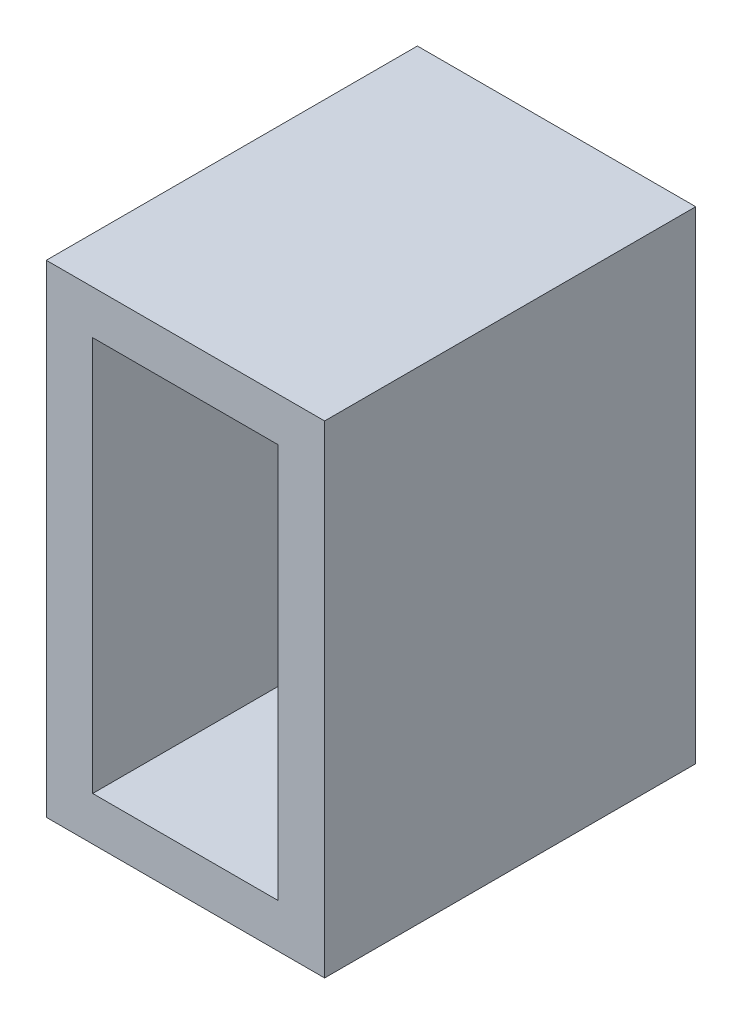
ISO-10303-21;
HEADER;
FILE_DESCRIPTION(('STEP AP214'),'2;1');
FILE_NAME('part.step','',(''),(''),'','','');
FILE_SCHEMA(('AUTOMOTIVE_DESIGN { 1 0 10303 214 1 1 1 1 }'));
ENDSEC;
DATA;
#1=APPLICATION_CONTEXT('core data for automotive mechanical design processes');
#2=APPLICATION_PROTOCOL_DEFINITION('international standard','automotive_design',2000,#1);
#3=PRODUCT_CONTEXT('',#1,'mechanical');
#4=PRODUCT('Part','Part','',(#3));
#5=PRODUCT_RELATED_PRODUCT_CATEGORY('part','',(#4));
#6=PRODUCT_DEFINITION_FORMATION('','',#4);
#7=PRODUCT_DEFINITION_CONTEXT('part definition',#1,'design');
#8=PRODUCT_DEFINITION('design','',#6,#7);
#9=PRODUCT_DEFINITION_SHAPE('','',#8);
#10=(LENGTH_UNIT() NAMED_UNIT(*) SI_UNIT(.MILLI.,.METRE.));
#11=(NAMED_UNIT(*) PLANE_ANGLE_UNIT() SI_UNIT($,.RADIAN.));
#12=(NAMED_UNIT(*) SI_UNIT($,.STERADIAN.) SOLID_ANGLE_UNIT());
#13=UNCERTAINTY_MEASURE_WITH_UNIT(LENGTH_MEASURE(1.E-05),#10,'distance_accuracy_value','');
#14=(GEOMETRIC_REPRESENTATION_CONTEXT(3) GLOBAL_UNCERTAINTY_ASSIGNED_CONTEXT((#13)) GLOBAL_UNIT_ASSIGNED_CONTEXT((#10,
#11,#12)) REPRESENTATION_CONTEXT('',''));
#15=CARTESIAN_POINT('',(0.,0.,0.));
#16=DIRECTION('',(0.,0.,1.));
#17=DIRECTION('',(1.,0.,0.));
#18=AXIS2_PLACEMENT_3D('',#15,#16,#17);
#19=CARTESIAN_POINT('',(0.,0.,5.588));
#20=DIRECTION('',(0.,0.,-1.));
#21=DIRECTION('',(-1.,0.,0.));
#22=AXIS2_PLACEMENT_3D('',#19,#20,#21);
#23=PLANE('',#22);
#24=DIRECTION('',(0.,1.,0.));
#25=VECTOR('',#24,1.);
#26=CARTESIAN_POINT('',(2.83827178729691,-26.357658788774,5.588));
#27=LINE('',#26,#25);
#28=CARTESIAN_POINT('',(2.83827178729691,-26.357658788774,5.588));
#29=VERTEX_POINT('',#28);
#30=CARTESIAN_POINT('',(2.83827178729691,-19.277408788774,5.588));
#31=VERTEX_POINT('',#30);
#32=EDGE_CURVE('E428',#29,#31,#27,.T.);
#33=ORIENTED_EDGE('',*,*,#32,.F.);
#34=DIRECTION('',(-1.,0.,0.));
#35=VECTOR('',#34,1.);
#36=CARTESIAN_POINT('',(0.,-26.357658788774,5.588));
#37=LINE('',#36,#35);
#38=CARTESIAN_POINT('',(-5.67072821270309,-26.357658788774,5.588));
#39=VERTEX_POINT('',#38);
#40=EDGE_CURVE('E265',#29,#39,#37,.T.);
#41=ORIENTED_EDGE('',*,*,#40,.T.);
#42=DIRECTION('',(0.,-1.,0.));
#43=VECTOR('',#42,1.);
#44=CARTESIAN_POINT('',(-5.67072821270309,-26.357658788774,5.588));
#45=LINE('',#44,#43);
#46=CARTESIAN_POINT('',(-5.67072821270309,-19.277408788774,5.588));
#47=VERTEX_POINT('',#46);
#48=EDGE_CURVE('E454',#47,#39,#45,.T.);
#49=ORIENTED_EDGE('',*,*,#48,.F.);
#50=DIRECTION('',(-1.,0.,0.));
#51=VECTOR('',#50,1.);
#52=CARTESIAN_POINT('',(0.,-19.277408788774,5.588));
#53=LINE('',#52,#51);
#54=EDGE_CURVE('E270',#31,#47,#53,.T.);
#55=ORIENTED_EDGE('',*,*,#54,.F.);
#56=EDGE_LOOP('',(#33,#41,#49,#55));
#57=FACE_BOUND('',#56,.T.);
#58=ADVANCED_FACE('F41',(#57),#23,.T.);
#59=DIRECTION('',(0.,1.,0.));
#60=VECTOR('',#59,1.);
#61=CARTESIAN_POINT('',(2.83827178729691,20.600591211226,5.588));
#62=LINE('',#61,#60);
#63=CARTESIAN_POINT('',(2.83827178729691,20.600591211226,5.588));
#64=VERTEX_POINT('',#63);
#65=CARTESIAN_POINT('',(2.83827178729691,27.680841211226,5.588));
#66=VERTEX_POINT('',#65);
#67=EDGE_CURVE('E207',#64,#66,#62,.T.);
#68=ORIENTED_EDGE('',*,*,#67,.F.);
#69=DIRECTION('',(-1.,0.,0.));
#70=VECTOR('',#69,1.);
#71=CARTESIAN_POINT('',(0.,20.600591211226,5.588));
#72=LINE('',#71,#70);
#73=CARTESIAN_POINT('',(-5.67072821270309,20.600591211226,5.588));
#74=VERTEX_POINT('',#73);
#75=EDGE_CURVE('E275',#64,#74,#72,.T.);
#76=ORIENTED_EDGE('',*,*,#75,.T.);
#77=CARTESIAN_POINT('',(-5.67072821270309,27.680841211226,5.588));
#78=VERTEX_POINT('',#77);
#79=EDGE_CURVE('E449',#78,#74,#45,.T.);
#80=ORIENTED_EDGE('',*,*,#79,.F.);
#81=DIRECTION('',(-1.,0.,0.));
#82=VECTOR('',#81,1.);
#83=CARTESIAN_POINT('',(0.,27.680841211226,5.588));
#84=LINE('',#83,#82);
#85=EDGE_CURVE('E264',#66,#78,#84,.T.);
#86=ORIENTED_EDGE('',*,*,#85,.F.);
#87=EDGE_LOOP('',(#68,#76,#80,#86));
#88=FACE_BOUND('',#87,.T.);
#89=ADVANCED_FACE('F490',(#88),#23,.T.);
#90=CARTESIAN_POINT('',(0.,20.600591211226,8.128));
#91=DIRECTION('',(0.,-1.,0.));
#92=DIRECTION('',(0.,0.,-1.));
#93=AXIS2_PLACEMENT_3D('',#90,#91,#92);
#94=PLANE('',#93);
#95=DIRECTION('',(0.,0.,-1.));
#96=VECTOR('',#95,1.);
#97=CARTESIAN_POINT('',(2.83827178729691,20.600591211226,8.128));
#98=LINE('',#97,#96);
#99=CARTESIAN_POINT('',(2.83827178729691,20.600591211226,8.128));
#100=VERTEX_POINT('',#99);
#101=EDGE_CURVE('E415',#100,#64,#98,.T.);
#102=ORIENTED_EDGE('',*,*,#101,.F.);
#103=DIRECTION('',(-1.,0.,0.));
#104=VECTOR('',#103,1.);
#105=CARTESIAN_POINT('',(0.,20.600591211226,8.128));
#106=LINE('',#105,#104);
#107=CARTESIAN_POINT('',(-5.67072821270309,20.600591211226,8.128));
#108=VERTEX_POINT('',#107);
#109=EDGE_CURVE('E221',#100,#108,#106,.T.);
#110=ORIENTED_EDGE('',*,*,#109,.T.);
#111=DIRECTION('',(0.,0.,-1.));
#112=VECTOR('',#111,1.);
#113=CARTESIAN_POINT('',(-5.67072821270309,20.600591211226,8.128));
#114=LINE('',#113,#112);
#115=EDGE_CURVE('E281',#108,#74,#114,.T.);
#116=ORIENTED_EDGE('',*,*,#115,.T.);
#117=ORIENTED_EDGE('',*,*,#75,.F.);
#118=EDGE_LOOP('',(#102,#110,#116,#117));
#119=FACE_BOUND('',#118,.T.);
#120=ADVANCED_FACE('F496',(#119),#94,.T.);
#121=CARTESIAN_POINT('',(0.,-19.277408788774,8.128));
#122=DIRECTION('',(0.,-1.,0.));
#123=DIRECTION('',(0.,0.,-1.));
#124=AXIS2_PLACEMENT_3D('',#121,#122,#123);
#125=PLANE('',#124);
#126=DIRECTION('',(-1.,0.,0.));
#127=VECTOR('',#126,1.);
#128=CARTESIAN_POINT('',(0.,-19.277408788774,8.128));
#129=LINE('',#128,#127);
#130=CARTESIAN_POINT('',(2.83827178729691,-19.277408788774,8.128));
#131=VERTEX_POINT('',#130);
#132=CARTESIAN_POINT('',(-5.67072821270309,-19.277408788774,8.128));
#133=VERTEX_POINT('',#132);
#134=EDGE_CURVE('E247',#131,#133,#129,.T.);
#135=ORIENTED_EDGE('',*,*,#134,.F.);
#136=DIRECTION('',(0.,0.,-1.));
#137=VECTOR('',#136,1.);
#138=CARTESIAN_POINT('',(2.83827178729691,-19.277408788774,8.128));
#139=LINE('',#138,#137);
#140=EDGE_CURVE('E427',#131,#31,#139,.T.);
#141=ORIENTED_EDGE('',*,*,#140,.T.);
#142=ORIENTED_EDGE('',*,*,#54,.T.);
#143=DIRECTION('',(0.,0.,-1.));
#144=VECTOR('',#143,1.);
#145=CARTESIAN_POINT('',(-5.67072821270309,-19.277408788774,8.128));
#146=LINE('',#145,#144);
#147=EDGE_CURVE('E259',#133,#47,#146,.T.);
#148=ORIENTED_EDGE('',*,*,#147,.F.);
#149=EDGE_LOOP('',(#135,#141,#142,#148));
#150=FACE_BOUND('',#149,.T.);
#151=ADVANCED_FACE('F506',(#150),#125,.F.);
#152=CARTESIAN_POINT('',(0.,0.,8.128));
#153=DIRECTION('',(0.,0.,-1.));
#154=DIRECTION('',(-1.,0.,0.));
#155=AXIS2_PLACEMENT_3D('',#152,#153,#154);
#156=PLANE('',#155);
#157=ORIENTED_EDGE('',*,*,#109,.F.);
#158=DIRECTION('',(0.,1.,0.));
#159=VECTOR('',#158,1.);
#160=CARTESIAN_POINT('',(2.83827178729691,20.600591211226,8.128));
#161=LINE('',#160,#159);
#162=CARTESIAN_POINT('',(2.83827178729691,27.680841211226,8.128));
#163=VERTEX_POINT('',#162);
#164=EDGE_CURVE('E204',#100,#163,#161,.T.);
#165=ORIENTED_EDGE('',*,*,#164,.T.);
#166=DIRECTION('',(-1.,0.,0.));
#167=VECTOR('',#166,1.);
#168=CARTESIAN_POINT('',(0.,27.680841211226,8.128));
#169=LINE('',#168,#167);
#170=CARTESIAN_POINT('',(-8.59172821270309,27.680841211226,8.128));
#171=VERTEX_POINT('',#170);
#172=EDGE_CURVE('E218',#163,#171,#169,.T.);
#173=ORIENTED_EDGE('',*,*,#172,.T.);
#174=DIRECTION('',(0.,-1.,0.));
#175=VECTOR('',#174,1.);
#176=CARTESIAN_POINT('',(-8.59172821270309,0.,8.128));
#177=LINE('',#176,#175);
#178=CARTESIAN_POINT('',(-8.59172821270309,-26.357658788774,8.128));
#179=VERTEX_POINT('',#178);
#180=EDGE_CURVE('E231',#171,#179,#177,.T.);
#181=ORIENTED_EDGE('',*,*,#180,.T.);
#182=DIRECTION('',(-1.,0.,0.));
#183=VECTOR('',#182,1.);
#184=CARTESIAN_POINT('',(0.,-26.357658788774,8.128));
#185=LINE('',#184,#183);
#186=CARTESIAN_POINT('',(2.83827178729691,-26.357658788774,8.128));
#187=VERTEX_POINT('',#186);
#188=EDGE_CURVE('E280',#187,#179,#185,.T.);
#189=ORIENTED_EDGE('',*,*,#188,.F.);
#190=DIRECTION('',(0.,1.,0.));
#191=VECTOR('',#190,1.);
#192=CARTESIAN_POINT('',(2.83827178729691,-26.357658788774,8.128));
#193=LINE('',#192,#191);
#194=EDGE_CURVE('E419',#187,#131,#193,.T.);
#195=ORIENTED_EDGE('',*,*,#194,.T.);
#196=ORIENTED_EDGE('',*,*,#134,.T.);
#197=DIRECTION('',(0.,1.,0.));
#198=VECTOR('',#197,1.);
#199=CARTESIAN_POINT('',(-5.67072821270309,0.,8.128));
#200=LINE('',#199,#198);
#201=EDGE_CURVE('E244',#133,#108,#200,.T.);
#202=ORIENTED_EDGE('',*,*,#201,.T.);
#203=EDGE_LOOP('',(#157,#165,#173,#181,#189,#195,#196,#202));
#204=FACE_BOUND('',#203,.T.);
#205=ADVANCED_FACE('F216',(#204),#156,.F.);
#206=DIRECTION('',(0.,-1.,0.));
#207=VECTOR('',#206,1.);
#208=CARTESIAN_POINT('',(5.37827178729691,-26.357658788774,5.588));
#209=LINE('',#208,#207);
#210=CARTESIAN_POINT('',(5.37827178729691,-19.277408788774,5.588));
#211=VERTEX_POINT('',#210);
#212=CARTESIAN_POINT('',(5.37827178729691,-26.357658788774,5.588));
#213=VERTEX_POINT('',#212);
#214=EDGE_CURVE('E424',#211,#213,#209,.T.);
#215=ORIENTED_EDGE('',*,*,#214,.F.);
#216=CARTESIAN_POINT('',(13.8872717872969,-19.277408788774,5.588));
#217=VERTEX_POINT('',#216);
#218=EDGE_CURVE('E271',#217,#211,#53,.T.);
#219=ORIENTED_EDGE('',*,*,#218,.F.);
#220=DIRECTION('',(0.,1.,0.));
#221=VECTOR('',#220,1.);
#222=CARTESIAN_POINT('',(13.8872717872969,-26.357658788774,5.588));
#223=LINE('',#222,#221);
#224=CARTESIAN_POINT('',(13.8872717872969,-26.357658788774,5.588));
#225=VERTEX_POINT('',#224);
#226=EDGE_CURVE('E447',#225,#217,#223,.T.);
#227=ORIENTED_EDGE('',*,*,#226,.F.);
#228=EDGE_CURVE('E260',#225,#213,#37,.T.);
#229=ORIENTED_EDGE('',*,*,#228,.T.);
#230=EDGE_LOOP('',(#215,#219,#227,#229));
#231=FACE_BOUND('',#230,.T.);
#232=ADVANCED_FACE('F487',(#231),#23,.T.);
#233=DIRECTION('',(0.,-1.,0.));
#234=VECTOR('',#233,1.);
#235=CARTESIAN_POINT('',(5.37827178729691,20.600591211226,5.588));
#236=LINE('',#235,#234);
#237=CARTESIAN_POINT('',(5.37827178729691,27.680841211226,5.588));
#238=VERTEX_POINT('',#237);
#239=CARTESIAN_POINT('',(5.37827178729691,20.600591211226,5.588));
#240=VERTEX_POINT('',#239);
#241=EDGE_CURVE('E223',#238,#240,#236,.T.);
#242=ORIENTED_EDGE('',*,*,#241,.F.);
#243=CARTESIAN_POINT('',(13.8872717872969,27.680841211226,5.588));
#244=VERTEX_POINT('',#243);
#245=EDGE_CURVE('E266',#244,#238,#84,.T.);
#246=ORIENTED_EDGE('',*,*,#245,.F.);
#247=DIRECTION('',(0.,-1.,0.));
#248=VECTOR('',#247,1.);
#249=CARTESIAN_POINT('',(13.8872717872969,0.,5.588));
#250=LINE('',#249,#248);
#251=CARTESIAN_POINT('',(13.8872717872969,20.600591211226,5.588));
#252=VERTEX_POINT('',#251);
#253=EDGE_CURVE('E11',#244,#252,#250,.T.);
#254=ORIENTED_EDGE('',*,*,#253,.T.);
#255=EDGE_CURVE('E276',#252,#240,#72,.T.);
#256=ORIENTED_EDGE('',*,*,#255,.T.);
#257=EDGE_LOOP('',(#242,#246,#254,#256));
#258=FACE_BOUND('',#257,.T.);
#259=ADVANCED_FACE('F480',(#258),#23,.T.);
#260=CARTESIAN_POINT('',(-8.59172821270309,27.680841211226,50.8));
#261=DIRECTION('',(1.,0.,0.));
#262=DIRECTION('',(0.,1.,0.));
#263=AXIS2_PLACEMENT_3D('',#260,#261,#262);
#264=PLANE('',#263);
#265=DIRECTION('',(0.,0.,-1.));
#266=VECTOR('',#265,1.);
#267=CARTESIAN_POINT('',(-8.59172821270309,-26.357658788774,50.8));
#268=LINE('',#267,#266);
#269=CARTESIAN_POINT('',(-8.59172821270309,-26.357658788774,50.8));
#270=VERTEX_POINT('',#269);
#271=EDGE_CURVE('E326',#270,#179,#268,.T.);
#272=ORIENTED_EDGE('',*,*,#271,.T.);
#273=ORIENTED_EDGE('',*,*,#180,.F.);
#274=DIRECTION('',(0.,0.,-1.));
#275=VECTOR('',#274,1.);
#276=CARTESIAN_POINT('',(-8.59172821270309,27.680841211226,50.8));
#277=LINE('',#276,#275);
#278=CARTESIAN_POINT('',(-8.59172821270309,27.680841211226,50.8));
#279=VERTEX_POINT('',#278);
#280=EDGE_CURVE('E228',#279,#171,#277,.T.);
#281=ORIENTED_EDGE('',*,*,#280,.F.);
#282=DIRECTION('',(0.,-1.,0.));
#283=VECTOR('',#282,1.);
#284=CARTESIAN_POINT('',(-8.59172821270309,27.680841211226,50.8));
#285=LINE('',#284,#283);
#286=EDGE_CURVE('E297',#279,#270,#285,.T.);
#287=ORIENTED_EDGE('',*,*,#286,.T.);
#288=EDGE_LOOP('',(#272,#273,#281,#287));
#289=FACE_BOUND('',#288,.T.);
#290=ADVANCED_FACE('F478',(#289),#264,.T.);
#291=CARTESIAN_POINT('',(-8.59172821270309,-26.357658788774,50.8));
#292=DIRECTION('',(0.,1.,0.));
#293=DIRECTION('',(0.,0.,1.));
#294=AXIS2_PLACEMENT_3D('',#291,#292,#293);
#295=PLANE('',#294);
#296=DIRECTION('',(0.,0.,-1.));
#297=VECTOR('',#296,1.);
#298=CARTESIAN_POINT('',(16.8082717872969,-26.357658788774,50.8));
#299=LINE('',#298,#297);
#300=CARTESIAN_POINT('',(16.8082717872969,-26.357658788774,50.8));
#301=VERTEX_POINT('',#300);
#302=CARTESIAN_POINT('',(16.8082717872969,-26.357658788774,8.128));
#303=VERTEX_POINT('',#302);
#304=EDGE_CURVE('E322',#301,#303,#299,.T.);
#305=ORIENTED_EDGE('',*,*,#304,.T.);
#306=CARTESIAN_POINT('',(5.37827178729691,-26.357658788774,8.128));
#307=VERTEX_POINT('',#306);
#308=EDGE_CURVE('E237',#303,#307,#185,.T.);
#309=ORIENTED_EDGE('',*,*,#308,.T.);
#310=DIRECTION('',(0.,0.,-1.));
#311=VECTOR('',#310,1.);
#312=CARTESIAN_POINT('',(5.37827178729691,-26.357658788774,8.128));
#313=LINE('',#312,#311);
#314=EDGE_CURVE('E65',#307,#213,#313,.T.);
#315=ORIENTED_EDGE('',*,*,#314,.T.);
#316=ORIENTED_EDGE('',*,*,#228,.F.);
#317=DIRECTION('',(0.,0.,1.));
#318=VECTOR('',#317,1.);
#319=CARTESIAN_POINT('',(13.8872717872969,-26.357658788774,-54.1173883631684));
#320=LINE('',#319,#318);
#321=CARTESIAN_POINT('',(13.8872717872969,-26.357658788774,0.));
#322=VERTEX_POINT('',#321);
#323=EDGE_CURVE('E465',#322,#225,#320,.T.);
#324=ORIENTED_EDGE('',*,*,#323,.F.);
#325=DIRECTION('',(1.,0.,0.));
#326=VECTOR('',#325,1.);
#327=CARTESIAN_POINT('',(-8.59172821270309,-26.357658788774,0.));
#328=LINE('',#327,#326);
#329=CARTESIAN_POINT('',(-5.67072821270309,-26.357658788774,0.));
#330=VERTEX_POINT('',#329);
#331=EDGE_CURVE('E285',#330,#322,#328,.T.);
#332=ORIENTED_EDGE('',*,*,#331,.F.);
#333=DIRECTION('',(0.,0.,1.));
#334=VECTOR('',#333,1.);
#335=CARTESIAN_POINT('',(-5.67072821270309,-26.357658788774,-54.1173883631684));
#336=LINE('',#335,#334);
#337=EDGE_CURVE('E453',#330,#39,#336,.T.);
#338=ORIENTED_EDGE('',*,*,#337,.T.);
#339=ORIENTED_EDGE('',*,*,#40,.F.);
#340=DIRECTION('',(0.,0.,-1.));
#341=VECTOR('',#340,1.);
#342=CARTESIAN_POINT('',(2.83827178729691,-26.357658788774,8.128));
#343=LINE('',#342,#341);
#344=EDGE_CURVE('E433',#187,#29,#343,.T.);
#345=ORIENTED_EDGE('',*,*,#344,.F.);
#346=ORIENTED_EDGE('',*,*,#188,.T.);
#347=ORIENTED_EDGE('',*,*,#271,.F.);
#348=DIRECTION('',(1.,0.,0.));
#349=VECTOR('',#348,1.);
#350=CARTESIAN_POINT('',(-8.59172821270309,-26.357658788774,50.8));
#351=LINE('',#350,#349);
#352=EDGE_CURVE('E300',#270,#301,#351,.T.);
#353=ORIENTED_EDGE('',*,*,#352,.T.);
#354=EDGE_LOOP('',(#305,#309,#315,#316,#324,#332,#338,#339,#345,#346,#347,#353));
#355=FACE_BOUND('',#354,.T.);
#356=ADVANCED_FACE('F400',(#355),#295,.T.);
#357=CARTESIAN_POINT('',(16.8082717872969,27.680841211226,50.8));
#358=DIRECTION('',(-1.,0.,0.));
#359=DIRECTION('',(0.,0.,1.));
#360=AXIS2_PLACEMENT_3D('',#357,#358,#359);
#361=PLANE('',#360);
#362=DIRECTION('',(0.,0.,-1.));
#363=VECTOR('',#362,1.);
#364=CARTESIAN_POINT('',(16.8082717872969,27.680841211226,50.8));
#365=LINE('',#364,#363);
#366=CARTESIAN_POINT('',(16.8082717872969,27.680841211226,50.8));
#367=VERTEX_POINT('',#366);
#368=CARTESIAN_POINT('',(16.8082717872969,27.680841211226,8.128));
#369=VERTEX_POINT('',#368);
#370=EDGE_CURVE('E318',#367,#369,#365,.T.);
#371=ORIENTED_EDGE('',*,*,#370,.T.);
#372=DIRECTION('',(0.,-1.,0.));
#373=VECTOR('',#372,1.);
#374=CARTESIAN_POINT('',(16.8082717872969,0.,8.128));
#375=LINE('',#374,#373);
#376=EDGE_CURVE('E236',#369,#303,#375,.T.);
#377=ORIENTED_EDGE('',*,*,#376,.T.);
#378=ORIENTED_EDGE('',*,*,#304,.F.);
#379=DIRECTION('',(0.,1.,0.));
#380=VECTOR('',#379,1.);
#381=CARTESIAN_POINT('',(16.8082717872969,27.680841211226,50.8));
#382=LINE('',#381,#380);
#383=EDGE_CURVE('E304',#301,#367,#382,.T.);
#384=ORIENTED_EDGE('',*,*,#383,.T.);
#385=EDGE_LOOP('',(#371,#377,#378,#384));
#386=FACE_BOUND('',#385,.T.);
#387=ADVANCED_FACE('F403',(#386),#361,.T.);
#388=CARTESIAN_POINT('',(-8.59172821270309,27.680841211226,50.8));
#389=DIRECTION('',(0.,-1.,0.));
#390=DIRECTION('',(1.,0.,0.));
#391=AXIS2_PLACEMENT_3D('',#388,#389,#390);
#392=PLANE('',#391);
#393=ORIENTED_EDGE('',*,*,#280,.T.);
#394=ORIENTED_EDGE('',*,*,#172,.F.);
#395=DIRECTION('',(0.,0.,-1.));
#396=VECTOR('',#395,1.);
#397=CARTESIAN_POINT('',(2.83827178729691,27.680841211226,8.128));
#398=LINE('',#397,#396);
#399=EDGE_CURVE('E201',#163,#66,#398,.T.);
#400=ORIENTED_EDGE('',*,*,#399,.T.);
#401=ORIENTED_EDGE('',*,*,#85,.T.);
#402=DIRECTION('',(0.,0.,1.));
#403=VECTOR('',#402,1.);
#404=CARTESIAN_POINT('',(-5.67072821270309,27.680841211226,-54.1173883631684));
#405=LINE('',#404,#403);
#406=CARTESIAN_POINT('',(-5.67072821270309,27.680841211226,0.));
#407=VERTEX_POINT('',#406);
#408=EDGE_CURVE('E448',#407,#78,#405,.T.);
#409=ORIENTED_EDGE('',*,*,#408,.F.);
#410=DIRECTION('',(-1.,0.,0.));
#411=VECTOR('',#410,1.);
#412=CARTESIAN_POINT('',(-8.59172821270309,27.680841211226,0.));
#413=LINE('',#412,#411);
#414=CARTESIAN_POINT('',(13.8872717872969,27.680841211226,0.));
#415=VERTEX_POINT('',#414);
#416=EDGE_CURVE('E301',#415,#407,#413,.T.);
#417=ORIENTED_EDGE('',*,*,#416,.F.);
#418=DIRECTION('',(0.,0.,1.));
#419=VECTOR('',#418,1.);
#420=CARTESIAN_POINT('',(13.8872717872969,27.680841211226,-54.1173883631684));
#421=LINE('',#420,#419);
#422=EDGE_CURVE('E468',#415,#244,#421,.T.);
#423=ORIENTED_EDGE('',*,*,#422,.T.);
#424=ORIENTED_EDGE('',*,*,#245,.T.);
#425=DIRECTION('',(0.,0.,-1.));
#426=VECTOR('',#425,1.);
#427=CARTESIAN_POINT('',(5.37827178729691,27.680841211226,8.128));
#428=LINE('',#427,#426);
#429=CARTESIAN_POINT('',(5.37827178729691,27.680841211226,8.128));
#430=VERTEX_POINT('',#429);
#431=EDGE_CURVE('E212',#430,#238,#428,.T.);
#432=ORIENTED_EDGE('',*,*,#431,.F.);
#433=EDGE_CURVE('E230',#369,#430,#169,.T.);
#434=ORIENTED_EDGE('',*,*,#433,.F.);
#435=ORIENTED_EDGE('',*,*,#370,.F.);
#436=DIRECTION('',(-1.,0.,0.));
#437=VECTOR('',#436,1.);
#438=CARTESIAN_POINT('',(-8.59172821270309,27.680841211226,50.8));
#439=LINE('',#438,#437);
#440=EDGE_CURVE('E308',#367,#279,#439,.T.);
#441=ORIENTED_EDGE('',*,*,#440,.T.);
#442=EDGE_LOOP('',(#393,#394,#400,#401,#409,#417,#423,#424,#432,#434,#435,#441));
#443=FACE_BOUND('',#442,.T.);
#444=ADVANCED_FACE('F226',(#443),#392,.T.);
#445=CARTESIAN_POINT('',(0.,0.,50.8));
#446=DIRECTION('',(0.,0.,1.));
#447=DIRECTION('',(1.,0.,0.));
#448=AXIS2_PLACEMENT_3D('',#445,#446,#447);
#449=PLANE('',#448);
#450=DIRECTION('',(0.,-1.,0.));
#451=VECTOR('',#450,1.);
#452=CARTESIAN_POINT('',(-14.9417282127031,33.681591211226,50.8));
#453=LINE('',#452,#451);
#454=CARTESIAN_POINT('',(-14.9417282127031,33.681591211226,50.8));
#455=VERTEX_POINT('',#454);
#456=CARTESIAN_POINT('',(-14.9417282127031,-32.358408788774,50.8));
#457=VERTEX_POINT('',#456);
#458=EDGE_CURVE('E331',#455,#457,#453,.T.);
#459=ORIENTED_EDGE('',*,*,#458,.T.);
#460=DIRECTION('',(1.,0.,0.));
#461=VECTOR('',#460,1.);
#462=CARTESIAN_POINT('',(-14.9417282127031,-32.358408788774,50.8));
#463=LINE('',#462,#461);
#464=CARTESIAN_POINT('',(23.1582717872969,-32.358408788774,50.8));
#465=VERTEX_POINT('',#464);
#466=EDGE_CURVE('E335',#457,#465,#463,.T.);
#467=ORIENTED_EDGE('',*,*,#466,.T.);
#468=DIRECTION('',(0.,1.,0.));
#469=VECTOR('',#468,1.);
#470=CARTESIAN_POINT('',(23.1582717872969,33.681591211226,50.8));
#471=LINE('',#470,#469);
#472=CARTESIAN_POINT('',(23.1582717872969,33.681591211226,50.8));
#473=VERTEX_POINT('',#472);
#474=EDGE_CURVE('E339',#465,#473,#471,.T.);
#475=ORIENTED_EDGE('',*,*,#474,.T.);
#476=DIRECTION('',(-1.,0.,0.));
#477=VECTOR('',#476,1.);
#478=CARTESIAN_POINT('',(-14.9417282127031,33.681591211226,50.8));
#479=LINE('',#478,#477);
#480=EDGE_CURVE('E342',#473,#455,#479,.T.);
#481=ORIENTED_EDGE('',*,*,#480,.T.);
#482=EDGE_LOOP('',(#459,#467,#475,#481));
#483=FACE_BOUND('',#482,.T.);
#484=ORIENTED_EDGE('',*,*,#352,.F.);
#485=ORIENTED_EDGE('',*,*,#286,.F.);
#486=ORIENTED_EDGE('',*,*,#440,.F.);
#487=ORIENTED_EDGE('',*,*,#383,.F.);
#488=EDGE_LOOP('',(#484,#485,#486,#487));
#489=FACE_BOUND('',#488,.T.);
#490=ADVANCED_FACE('F389',(#483,#489),#449,.T.);
#491=CARTESIAN_POINT('',(0.,0.,0.));
#492=DIRECTION('',(0.,0.,1.));
#493=DIRECTION('',(1.,0.,0.));
#494=AXIS2_PLACEMENT_3D('',#491,#492,#493);
#495=PLANE('',#494);
#496=DIRECTION('',(0.,1.,0.));
#497=VECTOR('',#496,1.);
#498=CARTESIAN_POINT('',(-5.67072821270309,-26.357658788774,0.));
#499=LINE('',#498,#497);
#500=EDGE_CURVE('E444',#330,#407,#499,.T.);
#501=ORIENTED_EDGE('',*,*,#500,.F.);
#502=ORIENTED_EDGE('',*,*,#331,.T.);
#503=DIRECTION('',(0.,-1.,0.));
#504=VECTOR('',#503,1.);
#505=CARTESIAN_POINT('',(13.8872717872969,-26.357658788774,0.));
#506=LINE('',#505,#504);
#507=EDGE_CURVE('E461',#415,#322,#506,.T.);
#508=ORIENTED_EDGE('',*,*,#507,.F.);
#509=ORIENTED_EDGE('',*,*,#416,.T.);
#510=EDGE_LOOP('',(#501,#502,#508,#509));
#511=FACE_BOUND('',#510,.T.);
#512=DIRECTION('',(0.,-1.,0.));
#513=VECTOR('',#512,1.);
#514=CARTESIAN_POINT('',(-14.9417282127031,33.681591211226,0.));
#515=LINE('',#514,#513);
#516=CARTESIAN_POINT('',(-14.9417282127031,33.681591211226,0.));
#517=VERTEX_POINT('',#516);
#518=CARTESIAN_POINT('',(-14.9417282127031,-32.358408788774,0.));
#519=VERTEX_POINT('',#518);
#520=EDGE_CURVE('E330',#517,#519,#515,.T.);
#521=ORIENTED_EDGE('',*,*,#520,.F.);
#522=DIRECTION('',(-1.,0.,0.));
#523=VECTOR('',#522,1.);
#524=CARTESIAN_POINT('',(-14.9417282127031,33.681591211226,0.));
#525=LINE('',#524,#523);
#526=CARTESIAN_POINT('',(23.1582717872969,33.681591211226,0.));
#527=VERTEX_POINT('',#526);
#528=EDGE_CURVE('E336',#527,#517,#525,.T.);
#529=ORIENTED_EDGE('',*,*,#528,.F.);
#530=DIRECTION('',(0.,1.,0.));
#531=VECTOR('',#530,1.);
#532=CARTESIAN_POINT('',(23.1582717872969,33.681591211226,0.));
#533=LINE('',#532,#531);
#534=CARTESIAN_POINT('',(23.1582717872969,-32.358408788774,0.));
#535=VERTEX_POINT('',#534);
#536=EDGE_CURVE('E352',#535,#527,#533,.T.);
#537=ORIENTED_EDGE('',*,*,#536,.F.);
#538=DIRECTION('',(1.,0.,0.));
#539=VECTOR('',#538,1.);
#540=CARTESIAN_POINT('',(-14.9417282127031,-32.358408788774,0.));
#541=LINE('',#540,#539);
#542=EDGE_CURVE('E349',#519,#535,#541,.T.);
#543=ORIENTED_EDGE('',*,*,#542,.F.);
#544=EDGE_LOOP('',(#521,#529,#537,#543));
#545=FACE_BOUND('',#544,.T.);
#546=ADVANCED_FACE('F379',(#511,#545),#495,.F.);
#547=CARTESIAN_POINT('',(-14.9417282127031,33.681591211226,50.8));
#548=DIRECTION('',(1.,0.,0.));
#549=DIRECTION('',(0.,1.,0.));
#550=AXIS2_PLACEMENT_3D('',#547,#548,#549);
#551=PLANE('',#550);
#552=ORIENTED_EDGE('',*,*,#520,.T.);
#553=DIRECTION('',(0.,0.,-1.));
#554=VECTOR('',#553,1.);
#555=CARTESIAN_POINT('',(-14.9417282127031,-32.358408788774,50.8));
#556=LINE('',#555,#554);
#557=EDGE_CURVE('E50',#457,#519,#556,.T.);
#558=ORIENTED_EDGE('',*,*,#557,.F.);
#559=ORIENTED_EDGE('',*,*,#458,.F.);
#560=DIRECTION('',(0.,0.,-1.));
#561=VECTOR('',#560,1.);
#562=CARTESIAN_POINT('',(-14.9417282127031,33.681591211226,50.8));
#563=LINE('',#562,#561);
#564=EDGE_CURVE('E345',#455,#517,#563,.T.);
#565=ORIENTED_EDGE('',*,*,#564,.T.);
#566=EDGE_LOOP('',(#552,#558,#559,#565));
#567=FACE_BOUND('',#566,.T.);
#568=ADVANCED_FACE('F43',(#567),#551,.F.);
#569=CARTESIAN_POINT('',(-14.9417282127031,-32.358408788774,50.8));
#570=DIRECTION('',(0.,1.,0.));
#571=DIRECTION('',(-1.,0.,0.));
#572=AXIS2_PLACEMENT_3D('',#569,#570,#571);
#573=PLANE('',#572);
#574=ORIENTED_EDGE('',*,*,#542,.T.);
#575=DIRECTION('',(0.,0.,-1.));
#576=VECTOR('',#575,1.);
#577=CARTESIAN_POINT('',(23.1582717872969,-32.358408788774,50.8));
#578=LINE('',#577,#576);
#579=EDGE_CURVE('E364',#465,#535,#578,.T.);
#580=ORIENTED_EDGE('',*,*,#579,.F.);
#581=ORIENTED_EDGE('',*,*,#466,.F.);
#582=ORIENTED_EDGE('',*,*,#557,.T.);
#583=EDGE_LOOP('',(#574,#580,#581,#582));
#584=FACE_BOUND('',#583,.T.);
#585=ADVANCED_FACE('F371',(#584),#573,.F.);
#586=CARTESIAN_POINT('',(23.1582717872969,33.681591211226,50.8));
#587=DIRECTION('',(-1.,0.,0.));
#588=DIRECTION('',(0.,-1.,0.));
#589=AXIS2_PLACEMENT_3D('',#586,#587,#588);
#590=PLANE('',#589);
#591=ORIENTED_EDGE('',*,*,#536,.T.);
#592=DIRECTION('',(0.,0.,-1.));
#593=VECTOR('',#592,1.);
#594=CARTESIAN_POINT('',(23.1582717872969,33.681591211226,50.8));
#595=LINE('',#594,#593);
#596=EDGE_CURVE('E360',#473,#527,#595,.T.);
#597=ORIENTED_EDGE('',*,*,#596,.F.);
#598=ORIENTED_EDGE('',*,*,#474,.F.);
#599=ORIENTED_EDGE('',*,*,#579,.T.);
#600=EDGE_LOOP('',(#591,#597,#598,#599));
#601=FACE_BOUND('',#600,.T.);
#602=ADVANCED_FACE('F383',(#601),#590,.F.);
#603=CARTESIAN_POINT('',(-14.9417282127031,33.681591211226,50.8));
#604=DIRECTION('',(0.,-1.,0.));
#605=DIRECTION('',(1.,0.,0.));
#606=AXIS2_PLACEMENT_3D('',#603,#604,#605);
#607=PLANE('',#606);
#608=ORIENTED_EDGE('',*,*,#528,.T.);
#609=ORIENTED_EDGE('',*,*,#564,.F.);
#610=ORIENTED_EDGE('',*,*,#480,.F.);
#611=ORIENTED_EDGE('',*,*,#596,.T.);
#612=EDGE_LOOP('',(#608,#609,#610,#611));
#613=FACE_BOUND('',#612,.T.);
#614=ADVANCED_FACE('F387',(#613),#607,.F.);
#615=CARTESIAN_POINT('',(-5.67072821270309,0.,8.128));
#616=DIRECTION('',(-1.,0.,0.));
#617=DIRECTION('',(0.,0.,1.));
#618=AXIS2_PLACEMENT_3D('',#615,#616,#617);
#619=PLANE('',#618);
#620=ORIENTED_EDGE('',*,*,#147,.T.);
#621=ORIENTED_EDGE('',*,*,#48,.T.);
#622=ORIENTED_EDGE('',*,*,#337,.F.);
#623=ORIENTED_EDGE('',*,*,#500,.T.);
#624=ORIENTED_EDGE('',*,*,#408,.T.);
#625=ORIENTED_EDGE('',*,*,#79,.T.);
#626=ORIENTED_EDGE('',*,*,#115,.F.);
#627=ORIENTED_EDGE('',*,*,#201,.F.);
#628=EDGE_LOOP('',(#620,#621,#622,#623,#624,#625,#626,#627));
#629=FACE_BOUND('',#628,.T.);
#630=ADVANCED_FACE('F529',(#629),#619,.F.);
#631=DIRECTION('',(0.,0.,-1.));
#632=VECTOR('',#631,1.);
#633=CARTESIAN_POINT('',(5.37827178729691,20.600591211226,8.128));
#634=LINE('',#633,#632);
#635=CARTESIAN_POINT('',(5.37827178729691,20.600591211226,8.128));
#636=VERTEX_POINT('',#635);
#637=EDGE_CURVE('E411',#636,#240,#634,.T.);
#638=ORIENTED_EDGE('',*,*,#637,.T.);
#639=ORIENTED_EDGE('',*,*,#255,.F.);
#640=DIRECTION('',(0.,0.,-1.));
#641=VECTOR('',#640,1.);
#642=CARTESIAN_POINT('',(13.8872717872969,20.600591211226,8.128));
#643=LINE('',#642,#641);
#644=CARTESIAN_POINT('',(13.8872717872969,20.600591211226,8.128));
#645=VERTEX_POINT('',#644);
#646=EDGE_CURVE('E286',#645,#252,#643,.T.);
#647=ORIENTED_EDGE('',*,*,#646,.F.);
#648=EDGE_CURVE('E255',#645,#636,#106,.T.);
#649=ORIENTED_EDGE('',*,*,#648,.T.);
#650=EDGE_LOOP('',(#638,#639,#647,#649));
#651=FACE_BOUND('',#650,.T.);
#652=ADVANCED_FACE('F547',(#651),#94,.T.);
#653=CARTESIAN_POINT('',(13.8872717872969,0.,8.128));
#654=DIRECTION('',(1.,0.,0.));
#655=DIRECTION('',(0.,1.,0.));
#656=AXIS2_PLACEMENT_3D('',#653,#654,#655);
#657=PLANE('',#656);
#658=ORIENTED_EDGE('',*,*,#646,.T.);
#659=ORIENTED_EDGE('',*,*,#253,.F.);
#660=ORIENTED_EDGE('',*,*,#422,.F.);
#661=ORIENTED_EDGE('',*,*,#507,.T.);
#662=ORIENTED_EDGE('',*,*,#323,.T.);
#663=ORIENTED_EDGE('',*,*,#226,.T.);
#664=DIRECTION('',(0.,0.,-1.));
#665=VECTOR('',#664,1.);
#666=CARTESIAN_POINT('',(13.8872717872969,-19.277408788774,8.128));
#667=LINE('',#666,#665);
#668=CARTESIAN_POINT('',(13.8872717872969,-19.277408788774,8.128));
#669=VERTEX_POINT('',#668);
#670=EDGE_CURVE('E290',#669,#217,#667,.T.);
#671=ORIENTED_EDGE('',*,*,#670,.F.);
#672=DIRECTION('',(0.,-1.,0.));
#673=VECTOR('',#672,1.);
#674=CARTESIAN_POINT('',(13.8872717872969,0.,8.128));
#675=LINE('',#674,#673);
#676=EDGE_CURVE('E252',#645,#669,#675,.T.);
#677=ORIENTED_EDGE('',*,*,#676,.F.);
#678=EDGE_LOOP('',(#658,#659,#660,#661,#662,#663,#671,#677));
#679=FACE_BOUND('',#678,.T.);
#680=ADVANCED_FACE('F518',(#679),#657,.F.);
#681=ORIENTED_EDGE('',*,*,#218,.T.);
#682=DIRECTION('',(0.,0.,-1.));
#683=VECTOR('',#682,1.);
#684=CARTESIAN_POINT('',(5.37827178729691,-19.277408788774,8.128));
#685=LINE('',#684,#683);
#686=CARTESIAN_POINT('',(5.37827178729691,-19.277408788774,8.128));
#687=VERTEX_POINT('',#686);
#688=EDGE_CURVE('E438',#687,#211,#685,.T.);
#689=ORIENTED_EDGE('',*,*,#688,.F.);
#690=EDGE_CURVE('E248',#669,#687,#129,.T.);
#691=ORIENTED_EDGE('',*,*,#690,.F.);
#692=ORIENTED_EDGE('',*,*,#670,.T.);
#693=EDGE_LOOP('',(#681,#689,#691,#692));
#694=FACE_BOUND('',#693,.T.);
#695=ADVANCED_FACE('F513',(#694),#125,.F.);
#696=ORIENTED_EDGE('',*,*,#433,.T.);
#697=DIRECTION('',(0.,-1.,0.));
#698=VECTOR('',#697,1.);
#699=CARTESIAN_POINT('',(5.37827178729691,20.600591211226,8.128));
#700=LINE('',#699,#698);
#701=EDGE_CURVE('E57',#430,#636,#700,.T.);
#702=ORIENTED_EDGE('',*,*,#701,.T.);
#703=ORIENTED_EDGE('',*,*,#648,.F.);
#704=ORIENTED_EDGE('',*,*,#676,.T.);
#705=ORIENTED_EDGE('',*,*,#690,.T.);
#706=DIRECTION('',(0.,-1.,0.));
#707=VECTOR('',#706,1.);
#708=CARTESIAN_POINT('',(5.37827178729691,-26.357658788774,8.128));
#709=LINE('',#708,#707);
#710=EDGE_CURVE('E423',#687,#307,#709,.T.);
#711=ORIENTED_EDGE('',*,*,#710,.T.);
#712=ORIENTED_EDGE('',*,*,#308,.F.);
#713=ORIENTED_EDGE('',*,*,#376,.F.);
#714=EDGE_LOOP('',(#696,#702,#703,#704,#705,#711,#712,#713));
#715=FACE_BOUND('',#714,.T.);
#716=ADVANCED_FACE('F406',(#715),#156,.F.);
#717=CARTESIAN_POINT('',(2.83827178729691,-26.357658788774,8.128));
#718=DIRECTION('',(-1.,0.,0.));
#719=DIRECTION('',(0.,0.,1.));
#720=AXIS2_PLACEMENT_3D('',#717,#718,#719);
#721=PLANE('',#720);
#722=ORIENTED_EDGE('',*,*,#32,.T.);
#723=ORIENTED_EDGE('',*,*,#140,.F.);
#724=ORIENTED_EDGE('',*,*,#194,.F.);
#725=ORIENTED_EDGE('',*,*,#344,.T.);
#726=EDGE_LOOP('',(#722,#723,#724,#725));
#727=FACE_BOUND('',#726,.T.);
#728=ADVANCED_FACE('F560',(#727),#721,.F.);
#729=CARTESIAN_POINT('',(5.37827178729691,-26.357658788774,8.128));
#730=DIRECTION('',(1.,0.,0.));
#731=DIRECTION('',(0.,0.,-1.));
#732=AXIS2_PLACEMENT_3D('',#729,#730,#731);
#733=PLANE('',#732);
#734=ORIENTED_EDGE('',*,*,#214,.T.);
#735=ORIENTED_EDGE('',*,*,#314,.F.);
#736=ORIENTED_EDGE('',*,*,#710,.F.);
#737=ORIENTED_EDGE('',*,*,#688,.T.);
#738=EDGE_LOOP('',(#734,#735,#736,#737));
#739=FACE_BOUND('',#738,.T.);
#740=ADVANCED_FACE('F555',(#739),#733,.F.);
#741=CARTESIAN_POINT('',(2.83827178729691,20.600591211226,8.128));
#742=DIRECTION('',(-1.,0.,0.));
#743=DIRECTION('',(0.,0.,1.));
#744=AXIS2_PLACEMENT_3D('',#741,#742,#743);
#745=PLANE('',#744);
#746=ORIENTED_EDGE('',*,*,#67,.T.);
#747=ORIENTED_EDGE('',*,*,#399,.F.);
#748=ORIENTED_EDGE('',*,*,#164,.F.);
#749=ORIENTED_EDGE('',*,*,#101,.T.);
#750=EDGE_LOOP('',(#746,#747,#748,#749));
#751=FACE_BOUND('',#750,.T.);
#752=ADVANCED_FACE('F203',(#751),#745,.F.);
#753=CARTESIAN_POINT('',(5.37827178729691,20.600591211226,8.128));
#754=DIRECTION('',(1.,0.,0.));
#755=DIRECTION('',(0.,0.,-1.));
#756=AXIS2_PLACEMENT_3D('',#753,#754,#755);
#757=PLANE('',#756);
#758=ORIENTED_EDGE('',*,*,#241,.T.);
#759=ORIENTED_EDGE('',*,*,#637,.F.);
#760=ORIENTED_EDGE('',*,*,#701,.F.);
#761=ORIENTED_EDGE('',*,*,#431,.T.);
#762=EDGE_LOOP('',(#758,#759,#760,#761));
#763=FACE_BOUND('',#762,.T.);
#764=ADVANCED_FACE('F549',(#763),#757,.F.);
#765=CLOSED_SHELL('',(#58,#89,#120,#151,#205,#232,#259,#290,#356,#387,#444,#490,#546,#568,#585,
#602,#614,#630,#652,#680,#695,#716,#728,#740,#752,#764));
#766=MANIFOLD_SOLID_BREP('B2',#765);
#767=ADVANCED_BREP_SHAPE_REPRESENTATION('',(#18,#766),#14);
#768=SHAPE_DEFINITION_REPRESENTATION(#9,#767);
ENDSEC;
END-ISO-10303-21;
